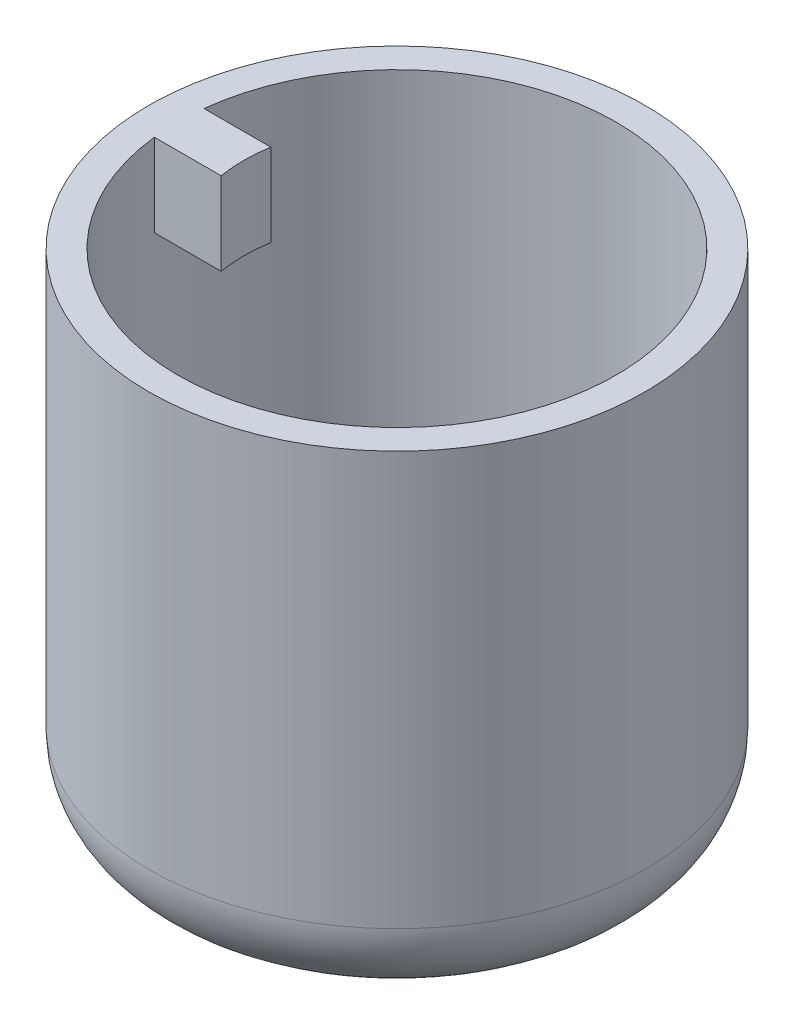
ISO-10303-21;
HEADER;
FILE_DESCRIPTION(('STEP AP214'),'2;1');
FILE_NAME('part.step','',(''),(''),'','','');
FILE_SCHEMA(('AUTOMOTIVE_DESIGN { 1 0 10303 214 1 1 1 1 }'));
ENDSEC;
DATA;
#1=APPLICATION_CONTEXT('core data for automotive mechanical design processes');
#2=APPLICATION_PROTOCOL_DEFINITION('international standard','automotive_design',2000,#1);
#3=PRODUCT_CONTEXT('',#1,'mechanical');
#4=PRODUCT('Part','Part','',(#3));
#5=PRODUCT_RELATED_PRODUCT_CATEGORY('part','',(#4));
#6=PRODUCT_DEFINITION_FORMATION('','',#4);
#7=PRODUCT_DEFINITION_CONTEXT('part definition',#1,'design');
#8=PRODUCT_DEFINITION('design','',#6,#7);
#9=PRODUCT_DEFINITION_SHAPE('','',#8);
#10=(LENGTH_UNIT() NAMED_UNIT(*) SI_UNIT(.MILLI.,.METRE.));
#11=(NAMED_UNIT(*) PLANE_ANGLE_UNIT() SI_UNIT($,.RADIAN.));
#12=(NAMED_UNIT(*) SI_UNIT($,.STERADIAN.) SOLID_ANGLE_UNIT());
#13=UNCERTAINTY_MEASURE_WITH_UNIT(LENGTH_MEASURE(1.E-05),#10,'distance_accuracy_value','');
#14=(GEOMETRIC_REPRESENTATION_CONTEXT(3) GLOBAL_UNCERTAINTY_ASSIGNED_CONTEXT((#13)) GLOBAL_UNIT_ASSIGNED_CONTEXT((#10,
#11,#12)) REPRESENTATION_CONTEXT('',''));
#15=CARTESIAN_POINT('',(0.,0.,0.));
#16=DIRECTION('',(0.,0.,1.));
#17=DIRECTION('',(1.,0.,0.));
#18=AXIS2_PLACEMENT_3D('',#15,#16,#17);
#19=CARTESIAN_POINT('',(0.,30.,0.));
#20=DIRECTION('',(0.,-1.,0.));
#21=DIRECTION('',(0.,0.,-1.));
#22=AXIS2_PLACEMENT_3D('',#19,#20,#21);
#23=CYLINDRICAL_SURFACE('',#22,15.);
#24=CARTESIAN_POINT('',(0.,5.,0.));
#25=DIRECTION('',(0.,1.,0.));
#26=DIRECTION('',(0.,0.,1.));
#27=AXIS2_PLACEMENT_3D('',#24,#25,#26);
#28=CIRCLE('',#27,15.);
#29=CARTESIAN_POINT('',(0.,5.,15.));
#30=VERTEX_POINT('',#29);
#31=EDGE_CURVE('E54',#30,#30,#28,.T.);
#32=ORIENTED_EDGE('',*,*,#31,.T.);
#33=EDGE_LOOP('',(#32));
#34=FACE_BOUND('',#33,.T.);
#35=CARTESIAN_POINT('',(0.,30.,0.));
#36=DIRECTION('',(0.,1.,0.));
#37=DIRECTION('',(0.,0.,1.));
#38=AXIS2_PLACEMENT_3D('',#35,#36,#37);
#39=CIRCLE('',#38,15.);
#40=CARTESIAN_POINT('',(0.,30.,15.));
#41=VERTEX_POINT('',#40);
#42=EDGE_CURVE('E146',#41,#41,#39,.T.);
#43=ORIENTED_EDGE('',*,*,#42,.F.);
#44=EDGE_LOOP('',(#43));
#45=FACE_BOUND('',#44,.T.);
#46=ADVANCED_FACE('F45',(#34,#45),#23,.T.);
#47=CARTESIAN_POINT('',(0.,30.,0.));
#48=DIRECTION('',(0.,1.,0.));
#49=DIRECTION('',(0.,0.,1.));
#50=AXIS2_PLACEMENT_3D('',#47,#48,#49);
#51=PLANE('',#50);
#52=CARTESIAN_POINT('',(0.,30.,0.));
#53=DIRECTION('',(0.,-1.,0.));
#54=DIRECTION('',(0.,0.,-1.));
#55=AXIS2_PLACEMENT_3D('',#52,#53,#54);
#56=CIRCLE('',#55,13.25);
#57=CARTESIAN_POINT('',(-13.1648205456816,30.,-1.5));
#58=VERTEX_POINT('',#57);
#59=CARTESIAN_POINT('',(-13.1648205456816,30.,1.5));
#60=VERTEX_POINT('',#59);
#61=EDGE_CURVE('E132',#58,#60,#56,.T.);
#62=ORIENTED_EDGE('',*,*,#61,.T.);
#63=DIRECTION('',(1.,0.,0.));
#64=VECTOR('',#63,1.);
#65=CARTESIAN_POINT('',(-13.1648205456816,30.,1.5));
#66=LINE('',#65,#64);
#67=CARTESIAN_POINT('',(-9.12756813176434,30.,1.5));
#68=VERTEX_POINT('',#67);
#69=EDGE_CURVE('E117',#60,#68,#66,.T.);
#70=ORIENTED_EDGE('',*,*,#69,.T.);
#71=CARTESIAN_POINT('',(-2.8796409701215E-13,30.,0.));
#72=DIRECTION('',(0.,-1.,0.));
#73=DIRECTION('',(0.,0.,-1.));
#74=AXIS2_PLACEMENT_3D('',#71,#72,#73);
#75=CIRCLE('',#74,9.24999999999972);
#76=CARTESIAN_POINT('',(-9.12756813176434,30.,-1.5));
#77=VERTEX_POINT('',#76);
#78=EDGE_CURVE('E100',#68,#77,#75,.T.);
#79=ORIENTED_EDGE('',*,*,#78,.T.);
#80=DIRECTION('',(-1.,0.,0.));
#81=VECTOR('',#80,1.);
#82=CARTESIAN_POINT('',(-13.1648205456816,30.,-1.5));
#83=LINE('',#82,#81);
#84=EDGE_CURVE('E61',#77,#58,#83,.T.);
#85=ORIENTED_EDGE('',*,*,#84,.T.);
#86=EDGE_LOOP('',(#62,#70,#79,#85));
#87=FACE_BOUND('',#86,.T.);
#88=ORIENTED_EDGE('',*,*,#42,.T.);
#89=EDGE_LOOP('',(#88));
#90=FACE_BOUND('',#89,.T.);
#91=ADVANCED_FACE('F164',(#87,#90),#51,.T.);
#92=CARTESIAN_POINT('',(0.,0.,0.));
#93=DIRECTION('',(0.,1.,0.));
#94=DIRECTION('',(0.,0.,1.));
#95=AXIS2_PLACEMENT_3D('',#92,#93,#94);
#96=PLANE('',#95);
#97=CARTESIAN_POINT('',(0.,0.,0.));
#98=DIRECTION('',(0.,1.,0.));
#99=DIRECTION('',(0.,0.,1.));
#100=AXIS2_PLACEMENT_3D('',#97,#98,#99);
#101=CIRCLE('',#100,10.);
#102=CARTESIAN_POINT('',(0.,0.,10.));
#103=VERTEX_POINT('',#102);
#104=EDGE_CURVE('E11',#103,#103,#101,.F.);
#105=ORIENTED_EDGE('',*,*,#104,.T.);
#106=EDGE_LOOP('',(#105));
#107=FACE_BOUND('',#106,.T.);
#108=CARTESIAN_POINT('',(0.,0.,0.));
#109=DIRECTION('',(0.,-1.,0.));
#110=DIRECTION('',(0.,0.,-1.));
#111=AXIS2_PLACEMENT_3D('',#108,#109,#110);
#112=CIRCLE('',#111,5.75);
#113=CARTESIAN_POINT('',(0.,0.,-5.75));
#114=VERTEX_POINT('',#113);
#115=EDGE_CURVE('E142',#114,#114,#112,.T.);
#116=ORIENTED_EDGE('',*,*,#115,.F.);
#117=EDGE_LOOP('',(#116));
#118=FACE_BOUND('',#117,.T.);
#119=ADVANCED_FACE('F168',(#107,#118),#96,.F.);
#120=CARTESIAN_POINT('',(0.,2.,0.));
#121=DIRECTION('',(0.,-1.,0.));
#122=DIRECTION('',(0.,0.,-1.));
#123=AXIS2_PLACEMENT_3D('',#120,#121,#122);
#124=CYLINDRICAL_SURFACE('',#123,5.75);
#125=CARTESIAN_POINT('',(0.,2.,0.));
#126=DIRECTION('',(0.,-1.,0.));
#127=DIRECTION('',(0.,0.,-1.));
#128=AXIS2_PLACEMENT_3D('',#125,#126,#127);
#129=CIRCLE('',#128,5.75);
#130=CARTESIAN_POINT('',(0.,2.,-5.75));
#131=VERTEX_POINT('',#130);
#132=EDGE_CURVE('E135',#131,#131,#129,.T.);
#133=ORIENTED_EDGE('',*,*,#132,.F.);
#134=EDGE_LOOP('',(#133));
#135=FACE_BOUND('',#134,.T.);
#136=ORIENTED_EDGE('',*,*,#115,.T.);
#137=EDGE_LOOP('',(#136));
#138=FACE_BOUND('',#137,.T.);
#139=ADVANCED_FACE('F171',(#135,#138),#124,.F.);
#140=CARTESIAN_POINT('',(0.,30.,0.));
#141=DIRECTION('',(0.,-1.,0.));
#142=DIRECTION('',(0.,0.,-1.));
#143=AXIS2_PLACEMENT_3D('',#140,#141,#142);
#144=CYLINDRICAL_SURFACE('',#143,13.25);
#145=ORIENTED_EDGE('',*,*,#61,.F.);
#146=DIRECTION('',(0.,1.,0.));
#147=VECTOR('',#146,1.);
#148=CARTESIAN_POINT('',(-13.1648205456816,25.,-1.5));
#149=LINE('',#148,#147);
#150=CARTESIAN_POINT('',(-13.1648205456816,25.,-1.5));
#151=VERTEX_POINT('',#150);
#152=EDGE_CURVE('E124',#151,#58,#149,.T.);
#153=ORIENTED_EDGE('',*,*,#152,.F.);
#154=CARTESIAN_POINT('',(0.,25.,0.));
#155=DIRECTION('',(0.,1.,0.));
#156=DIRECTION('',(0.,0.,1.));
#157=AXIS2_PLACEMENT_3D('',#154,#155,#156);
#158=CIRCLE('',#157,13.25);
#159=CARTESIAN_POINT('',(-13.1648205456816,25.,1.5));
#160=VERTEX_POINT('',#159);
#161=EDGE_CURVE('E70',#151,#160,#158,.T.);
#162=ORIENTED_EDGE('',*,*,#161,.T.);
#163=DIRECTION('',(0.,1.,0.));
#164=VECTOR('',#163,1.);
#165=CARTESIAN_POINT('',(-13.1648205456816,25.,1.5));
#166=LINE('',#165,#164);
#167=EDGE_CURVE('E94',#160,#60,#166,.T.);
#168=ORIENTED_EDGE('',*,*,#167,.T.);
#169=EDGE_LOOP('',(#145,#153,#162,#168));
#170=FACE_BOUND('',#169,.T.);
#171=CARTESIAN_POINT('',(0.,2.,0.));
#172=DIRECTION('',(0.,-1.,0.));
#173=DIRECTION('',(0.,0.,-1.));
#174=AXIS2_PLACEMENT_3D('',#171,#172,#173);
#175=CIRCLE('',#174,13.25);
#176=CARTESIAN_POINT('',(0.,2.,-13.25));
#177=VERTEX_POINT('',#176);
#178=EDGE_CURVE('E127',#177,#177,#175,.T.);
#179=ORIENTED_EDGE('',*,*,#178,.T.);
#180=EDGE_LOOP('',(#179));
#181=FACE_BOUND('',#180,.T.);
#182=ADVANCED_FACE('F176',(#170,#181),#144,.F.);
#183=CARTESIAN_POINT('',(0.,2.,0.));
#184=DIRECTION('',(0.,-1.,0.));
#185=DIRECTION('',(0.,0.,-1.));
#186=AXIS2_PLACEMENT_3D('',#183,#184,#185);
#187=PLANE('',#186);
#188=ORIENTED_EDGE('',*,*,#132,.T.);
#189=EDGE_LOOP('',(#188));
#190=FACE_BOUND('',#189,.T.);
#191=ORIENTED_EDGE('',*,*,#178,.F.);
#192=EDGE_LOOP('',(#191));
#193=FACE_BOUND('',#192,.T.);
#194=ADVANCED_FACE('F180',(#190,#193),#187,.F.);
#195=CARTESIAN_POINT('',(-13.1648205456816,25.,-1.5));
#196=DIRECTION('',(0.,0.,-1.));
#197=DIRECTION('',(-1.,0.,0.));
#198=AXIS2_PLACEMENT_3D('',#195,#196,#197);
#199=PLANE('',#198);
#200=ORIENTED_EDGE('',*,*,#84,.F.);
#201=DIRECTION('',(0.,1.,0.));
#202=VECTOR('',#201,1.);
#203=CARTESIAN_POINT('',(-9.12756813176434,25.,-1.5));
#204=LINE('',#203,#202);
#205=CARTESIAN_POINT('',(-9.12756813176434,25.,-1.5));
#206=VERTEX_POINT('',#205);
#207=EDGE_CURVE('E88',#206,#77,#204,.T.);
#208=ORIENTED_EDGE('',*,*,#207,.F.);
#209=DIRECTION('',(-1.,0.,0.));
#210=VECTOR('',#209,1.);
#211=CARTESIAN_POINT('',(-13.1648205456816,25.,-1.5));
#212=LINE('',#211,#210);
#213=EDGE_CURVE('E106',#206,#151,#212,.T.);
#214=ORIENTED_EDGE('',*,*,#213,.T.);
#215=ORIENTED_EDGE('',*,*,#152,.T.);
#216=EDGE_LOOP('',(#200,#208,#214,#215));
#217=FACE_BOUND('',#216,.T.);
#218=ADVANCED_FACE('F184',(#217),#199,.T.);
#219=CARTESIAN_POINT('',(-2.8796409701215E-13,25.,0.));
#220=DIRECTION('',(0.,1.,0.));
#221=DIRECTION('',(0.,0.,1.));
#222=AXIS2_PLACEMENT_3D('',#219,#220,#221);
#223=CYLINDRICAL_SURFACE('',#222,9.24999999999972);
#224=ORIENTED_EDGE('',*,*,#78,.F.);
#225=DIRECTION('',(0.,1.,0.));
#226=VECTOR('',#225,1.);
#227=CARTESIAN_POINT('',(-9.12756813176434,25.,1.5));
#228=LINE('',#227,#226);
#229=CARTESIAN_POINT('',(-9.12756813176434,25.,1.5));
#230=VERTEX_POINT('',#229);
#231=EDGE_CURVE('E96',#230,#68,#228,.T.);
#232=ORIENTED_EDGE('',*,*,#231,.F.);
#233=CARTESIAN_POINT('',(-2.8796409701215E-13,25.,0.));
#234=DIRECTION('',(0.,-1.,0.));
#235=DIRECTION('',(0.,0.,-1.));
#236=AXIS2_PLACEMENT_3D('',#233,#234,#235);
#237=CIRCLE('',#236,9.24999999999972);
#238=EDGE_CURVE('E99',#230,#206,#237,.T.);
#239=ORIENTED_EDGE('',*,*,#238,.T.);
#240=ORIENTED_EDGE('',*,*,#207,.T.);
#241=EDGE_LOOP('',(#224,#232,#239,#240));
#242=FACE_BOUND('',#241,.T.);
#243=ADVANCED_FACE('F98',(#242),#223,.F.);
#244=CARTESIAN_POINT('',(-13.1648205456816,25.,1.5));
#245=DIRECTION('',(0.,0.,1.));
#246=DIRECTION('',(1.,0.,0.));
#247=AXIS2_PLACEMENT_3D('',#244,#245,#246);
#248=PLANE('',#247);
#249=ORIENTED_EDGE('',*,*,#69,.F.);
#250=ORIENTED_EDGE('',*,*,#167,.F.);
#251=DIRECTION('',(1.,0.,0.));
#252=VECTOR('',#251,1.);
#253=CARTESIAN_POINT('',(-13.1648205456816,25.,1.5));
#254=LINE('',#253,#252);
#255=EDGE_CURVE('E105',#160,#230,#254,.T.);
#256=ORIENTED_EDGE('',*,*,#255,.T.);
#257=ORIENTED_EDGE('',*,*,#231,.T.);
#258=EDGE_LOOP('',(#249,#250,#256,#257));
#259=FACE_BOUND('',#258,.T.);
#260=ADVANCED_FACE('F109',(#259),#248,.T.);
#261=CARTESIAN_POINT('',(0.,25.,0.));
#262=DIRECTION('',(0.,1.,0.));
#263=DIRECTION('',(0.,0.,1.));
#264=AXIS2_PLACEMENT_3D('',#261,#262,#263);
#265=PLANE('',#264);
#266=ORIENTED_EDGE('',*,*,#161,.F.);
#267=ORIENTED_EDGE('',*,*,#213,.F.);
#268=ORIENTED_EDGE('',*,*,#238,.F.);
#269=ORIENTED_EDGE('',*,*,#255,.F.);
#270=EDGE_LOOP('',(#266,#267,#268,#269));
#271=FACE_BOUND('',#270,.T.);
#272=ADVANCED_FACE('F104',(#271),#265,.F.);
#273=CARTESIAN_POINT('',(0.,5.,0.));
#274=DIRECTION('',(0.,1.,0.));
#275=DIRECTION('',(0.,0.,1.));
#276=AXIS2_PLACEMENT_3D('',#273,#274,#275);
#277=TOROIDAL_SURFACE('',#276,10.,5.);
#278=ORIENTED_EDGE('',*,*,#104,.F.);
#279=EDGE_LOOP('',(#278));
#280=FACE_BOUND('',#279,.T.);
#281=ORIENTED_EDGE('',*,*,#31,.F.);
#282=EDGE_LOOP('',(#281));
#283=FACE_BOUND('',#282,.T.);
#284=ADVANCED_FACE('F47',(#280,#283),#277,.T.);
#285=CLOSED_SHELL('',(#46,#91,#119,#139,#182,#194,#218,#243,#260,#272,#284));
#286=MANIFOLD_SOLID_BREP('B2',#285);
#287=ADVANCED_BREP_SHAPE_REPRESENTATION('',(#18,#286),#14);
#288=SHAPE_DEFINITION_REPRESENTATION(#9,#287);
ENDSEC;
END-ISO-10303-21;
